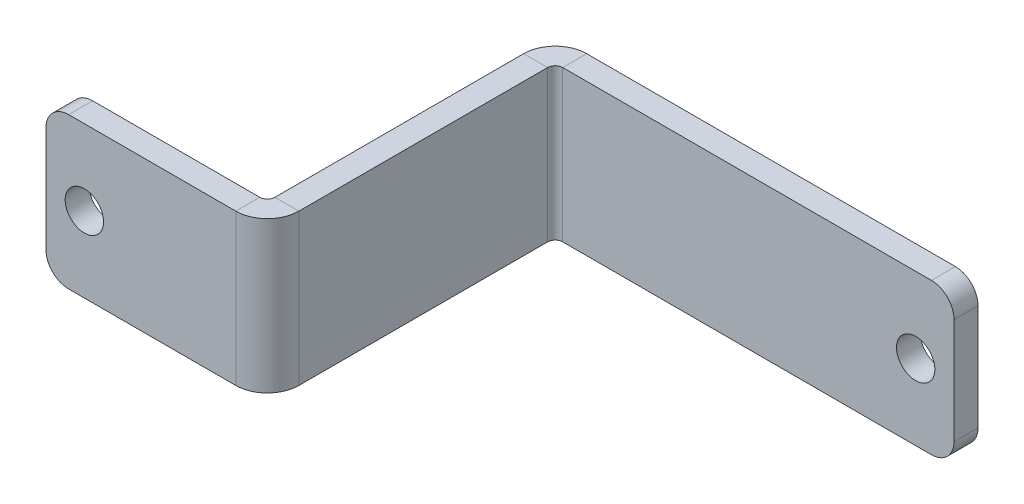
ISO-10303-21;
HEADER;
FILE_DESCRIPTION(('STEP AP214'),'2;1');
FILE_NAME('part.step','',(''),(''),'','','');
FILE_SCHEMA(('AUTOMOTIVE_DESIGN { 1 0 10303 214 1 1 1 1 }'));
ENDSEC;
DATA;
#1=APPLICATION_CONTEXT('core data for automotive mechanical design processes');
#2=APPLICATION_PROTOCOL_DEFINITION('international standard','automotive_design',2000,#1);
#3=PRODUCT_CONTEXT('',#1,'mechanical');
#4=PRODUCT('Part','Part','',(#3));
#5=PRODUCT_RELATED_PRODUCT_CATEGORY('part','',(#4));
#6=PRODUCT_DEFINITION_FORMATION('','',#4);
#7=PRODUCT_DEFINITION_CONTEXT('part definition',#1,'design');
#8=PRODUCT_DEFINITION('design','',#6,#7);
#9=PRODUCT_DEFINITION_SHAPE('','',#8);
#10=(LENGTH_UNIT() NAMED_UNIT(*) SI_UNIT(.MILLI.,.METRE.));
#11=(NAMED_UNIT(*) PLANE_ANGLE_UNIT() SI_UNIT($,.RADIAN.));
#12=(NAMED_UNIT(*) SI_UNIT($,.STERADIAN.) SOLID_ANGLE_UNIT());
#13=UNCERTAINTY_MEASURE_WITH_UNIT(LENGTH_MEASURE(1.E-05),#10,'distance_accuracy_value','');
#14=(GEOMETRIC_REPRESENTATION_CONTEXT(3) GLOBAL_UNCERTAINTY_ASSIGNED_CONTEXT((#13)) GLOBAL_UNIT_ASSIGNED_CONTEXT((#10,
#11,#12)) REPRESENTATION_CONTEXT('',''));
#15=CARTESIAN_POINT('',(0.,0.,0.));
#16=DIRECTION('',(0.,0.,1.));
#17=DIRECTION('',(1.,0.,0.));
#18=AXIS2_PLACEMENT_3D('',#15,#16,#17);
#19=CARTESIAN_POINT('',(104.144613579109,321.12805474167,-1949.68343430085));
#20=DIRECTION('',(0.,1.,0.));
#21=DIRECTION('',(0.,0.,1.));
#22=AXIS2_PLACEMENT_3D('',#19,#20,#21);
#23=PLANE('',#22);
#24=DIRECTION('',(0.,0.,-1.));
#25=VECTOR('',#24,1.);
#26=CARTESIAN_POINT('',(104.144613579109,321.12805474167,-1949.68343430085));
#27=LINE('',#26,#25);
#28=CARTESIAN_POINT('',(104.144613579109,321.12805474167,-1950.68343430085));
#29=VERTEX_POINT('',#28);
#30=CARTESIAN_POINT('',(104.144613579109,321.12805474167,-1983.62883430085));
#31=VERTEX_POINT('',#30);
#32=EDGE_CURVE('E235',#29,#31,#27,.T.);
#33=ORIENTED_EDGE('',*,*,#32,.T.);
#34=DIRECTION('',(-1.,0.,0.));
#35=VECTOR('',#34,1.);
#36=CARTESIAN_POINT('',(104.144613579109,321.12805474167,-1983.62883430085));
#37=LINE('',#36,#35);
#38=CARTESIAN_POINT('',(100.969613579109,321.12805474167,-1983.62883430085));
#39=VERTEX_POINT('',#38);
#40=EDGE_CURVE('E212',#31,#39,#37,.T.);
#41=ORIENTED_EDGE('',*,*,#40,.T.);
#42=DIRECTION('',(0.,0.,-1.));
#43=VECTOR('',#42,1.);
#44=CARTESIAN_POINT('',(100.969613579109,321.12805474167,-1949.68343430085));
#45=LINE('',#44,#43);
#46=CARTESIAN_POINT('',(100.969613579109,321.12805474167,-1950.68343430085));
#47=VERTEX_POINT('',#46);
#48=EDGE_CURVE('E234',#47,#39,#45,.T.);
#49=ORIENTED_EDGE('',*,*,#48,.F.);
#50=DIRECTION('',(1.,0.,0.));
#51=VECTOR('',#50,1.);
#52=CARTESIAN_POINT('',(100.969613579108,321.12805474167,-1950.68343430085));
#53=LINE('',#52,#51);
#54=EDGE_CURVE('E222',#47,#29,#53,.T.);
#55=ORIENTED_EDGE('',*,*,#54,.T.);
#56=EDGE_LOOP('',(#33,#41,#49,#55));
#57=FACE_BOUND('',#56,.T.);
#58=ADVANCED_FACE('F43',(#57),#23,.T.);
#59=CARTESIAN_POINT('',(104.144613579102,0.,3.71965965438128E-13));
#60=DIRECTION('',(-1.,0.,0.));
#61=DIRECTION('',(0.,0.,1.));
#62=AXIS2_PLACEMENT_3D('',#59,#60,#61);
#63=PLANE('',#62);
#64=DIRECTION('',(0.,1.,0.));
#65=VECTOR('',#64,1.);
#66=CARTESIAN_POINT('',(104.144613579109,321.12805474167,-1983.62883430085));
#67=LINE('',#66,#65);
#68=CARTESIAN_POINT('',(104.144613579109,301.12805474167,-1983.62883430085));
#69=VERTEX_POINT('',#68);
#70=EDGE_CURVE('E216',#31,#69,#67,.F.);
#71=ORIENTED_EDGE('',*,*,#70,.F.);
#72=ORIENTED_EDGE('',*,*,#32,.F.);
#73=DIRECTION('',(0.,1.,0.));
#74=VECTOR('',#73,1.);
#75=CARTESIAN_POINT('',(104.144613579109,0.,-1950.68343430085));
#76=LINE('',#75,#74);
#77=CARTESIAN_POINT('',(104.144613579109,301.12805474167,-1950.68343430085));
#78=VERTEX_POINT('',#77);
#79=EDGE_CURVE('E230',#78,#29,#76,.T.);
#80=ORIENTED_EDGE('',*,*,#79,.F.);
#81=DIRECTION('',(0.,0.,1.));
#82=VECTOR('',#81,1.);
#83=CARTESIAN_POINT('',(104.144613579109,301.12805474167,-1984.62883430085));
#84=LINE('',#83,#82);
#85=EDGE_CURVE('E238',#69,#78,#84,.T.);
#86=ORIENTED_EDGE('',*,*,#85,.F.);
#87=EDGE_LOOP('',(#71,#72,#80,#86));
#88=FACE_BOUND('',#87,.T.);
#89=ADVANCED_FACE('F349',(#88),#63,.F.);
#90=CARTESIAN_POINT('',(100.969613579102,0.,3.60880512187302E-13));
#91=DIRECTION('',(-1.,0.,0.));
#92=DIRECTION('',(0.,0.,1.));
#93=AXIS2_PLACEMENT_3D('',#90,#91,#92);
#94=PLANE('',#93);
#95=ORIENTED_EDGE('',*,*,#48,.T.);
#96=DIRECTION('',(0.,1.,0.));
#97=VECTOR('',#96,1.);
#98=CARTESIAN_POINT('',(100.969613579109,321.12805474167,-1983.62883430085));
#99=LINE('',#98,#97);
#100=CARTESIAN_POINT('',(100.969613579109,301.12805474167,-1983.62883430085));
#101=VERTEX_POINT('',#100);
#102=EDGE_CURVE('E180',#39,#101,#99,.F.);
#103=ORIENTED_EDGE('',*,*,#102,.T.);
#104=DIRECTION('',(0.,0.,1.));
#105=VECTOR('',#104,1.);
#106=CARTESIAN_POINT('',(100.969613579109,301.12805474167,-1984.62883430085));
#107=LINE('',#106,#105);
#108=CARTESIAN_POINT('',(100.969613579109,301.12805474167,-1950.68343430085));
#109=VERTEX_POINT('',#108);
#110=EDGE_CURVE('E239',#101,#109,#107,.T.);
#111=ORIENTED_EDGE('',*,*,#110,.T.);
#112=DIRECTION('',(0.,-1.,0.));
#113=VECTOR('',#112,1.);
#114=CARTESIAN_POINT('',(100.969613579108,321.12805474167,-1950.68343430085));
#115=LINE('',#114,#113);
#116=EDGE_CURVE('E224',#47,#109,#115,.T.);
#117=ORIENTED_EDGE('',*,*,#116,.F.);
#118=EDGE_LOOP('',(#95,#103,#111,#117));
#119=FACE_BOUND('',#118,.T.);
#120=ADVANCED_FACE('F356',(#119),#94,.T.);
#121=CARTESIAN_POINT('',(74.8292845848603,321.12805474167,-1946.50843430085));
#122=DIRECTION('',(0.,-1.,0.));
#123=DIRECTION('',(0.,0.,-1.));
#124=AXIS2_PLACEMENT_3D('',#121,#122,#123);
#125=PLANE('',#124);
#126=DIRECTION('',(-1.,0.,0.));
#127=VECTOR('',#126,1.);
#128=CARTESIAN_POINT('',(74.8292845848603,321.12805474167,-1949.68343430085));
#129=LINE('',#128,#127);
#130=CARTESIAN_POINT('',(99.9696135791085,321.12805474167,-1949.68343430085));
#131=VERTEX_POINT('',#130);
#132=CARTESIAN_POINT('',(77.8292845848603,321.12805474167,-1949.68343430085));
#133=VERTEX_POINT('',#132);
#134=EDGE_CURVE('E265',#131,#133,#129,.T.);
#135=ORIENTED_EDGE('',*,*,#134,.T.);
#136=DIRECTION('',(0.,0.,-1.));
#137=VECTOR('',#136,1.);
#138=CARTESIAN_POINT('',(77.8292845848603,321.12805474167,-1946.50843430085));
#139=LINE('',#138,#137);
#140=CARTESIAN_POINT('',(77.8292845848603,321.12805474167,-1946.50843430085));
#141=VERTEX_POINT('',#140);
#142=EDGE_CURVE('E11',#133,#141,#139,.F.);
#143=ORIENTED_EDGE('',*,*,#142,.T.);
#144=DIRECTION('',(-1.,0.,0.));
#145=VECTOR('',#144,1.);
#146=CARTESIAN_POINT('',(74.8292845848603,321.12805474167,-1946.50843430085));
#147=LINE('',#146,#145);
#148=CARTESIAN_POINT('',(99.9696135791085,321.12805474167,-1946.50843430085));
#149=VERTEX_POINT('',#148);
#150=EDGE_CURVE('E268',#149,#141,#147,.T.);
#151=ORIENTED_EDGE('',*,*,#150,.F.);
#152=DIRECTION('',(0.,0.,1.));
#153=VECTOR('',#152,1.);
#154=CARTESIAN_POINT('',(99.9696135791085,321.12805474167,-1949.68343430085));
#155=LINE('',#154,#153);
#156=EDGE_CURVE('E262',#131,#149,#155,.T.);
#157=ORIENTED_EDGE('',*,*,#156,.F.);
#158=EDGE_LOOP('',(#135,#143,#151,#157));
#159=FACE_BOUND('',#158,.T.);
#160=ADVANCED_FACE('F331',(#159),#125,.F.);
#161=CARTESIAN_POINT('',(74.8292845848603,301.12805474167,-1946.50843430085));
#162=DIRECTION('',(0.,1.,0.));
#163=DIRECTION('',(0.,0.,1.));
#164=AXIS2_PLACEMENT_3D('',#161,#162,#163);
#165=PLANE('',#164);
#166=DIRECTION('',(1.,0.,0.));
#167=VECTOR('',#166,1.);
#168=CARTESIAN_POINT('',(74.8292845848603,301.12805474167,-1946.50843430085));
#169=LINE('',#168,#167);
#170=CARTESIAN_POINT('',(77.8292845848603,301.12805474167,-1946.50843430085));
#171=VERTEX_POINT('',#170);
#172=CARTESIAN_POINT('',(99.9696135791085,301.12805474167,-1946.50843430085));
#173=VERTEX_POINT('',#172);
#174=EDGE_CURVE('E273',#171,#173,#169,.T.);
#175=ORIENTED_EDGE('',*,*,#174,.F.);
#176=DIRECTION('',(0.,0.,-1.));
#177=VECTOR('',#176,1.);
#178=CARTESIAN_POINT('',(77.8292845848603,301.12805474167,-1946.50843430085));
#179=LINE('',#178,#177);
#180=CARTESIAN_POINT('',(77.8292845848603,301.12805474167,-1949.68343430085));
#181=VERTEX_POINT('',#180);
#182=EDGE_CURVE('E296',#171,#181,#179,.T.);
#183=ORIENTED_EDGE('',*,*,#182,.T.);
#184=DIRECTION('',(1.,0.,0.));
#185=VECTOR('',#184,1.);
#186=CARTESIAN_POINT('',(74.8292845848603,301.12805474167,-1949.68343430085));
#187=LINE('',#186,#185);
#188=CARTESIAN_POINT('',(99.9696135791085,301.12805474167,-1949.68343430085));
#189=VERTEX_POINT('',#188);
#190=EDGE_CURVE('E271',#181,#189,#187,.T.);
#191=ORIENTED_EDGE('',*,*,#190,.T.);
#192=DIRECTION('',(0.,0.,1.));
#193=VECTOR('',#192,1.);
#194=CARTESIAN_POINT('',(99.9696135791085,301.12805474167,-1949.68343430085));
#195=LINE('',#194,#193);
#196=EDGE_CURVE('E252',#189,#173,#195,.T.);
#197=ORIENTED_EDGE('',*,*,#196,.T.);
#198=EDGE_LOOP('',(#175,#183,#191,#197));
#199=FACE_BOUND('',#198,.T.);
#200=ADVANCED_FACE('F317',(#199),#165,.F.);
#201=CARTESIAN_POINT('',(0.,0.,-1946.50843430085));
#202=DIRECTION('',(0.,0.,1.));
#203=DIRECTION('',(1.,0.,0.));
#204=AXIS2_PLACEMENT_3D('',#201,#202,#203);
#205=PLANE('',#204);
#206=CARTESIAN_POINT('',(79.9092845848603,311.12805474167,-1946.50843430085));
#207=DIRECTION('',(0.,0.,1.));
#208=DIRECTION('',(1.,0.,0.));
#209=AXIS2_PLACEMENT_3D('',#206,#207,#208);
#210=CIRCLE('',#209,2.54);
#211=CARTESIAN_POINT('',(82.4492845848603,311.12805474167,-1946.50843430085));
#212=VERTEX_POINT('',#211);
#213=EDGE_CURVE('E463',#212,#212,#210,.T.);
#214=ORIENTED_EDGE('',*,*,#213,.F.);
#215=EDGE_LOOP('',(#214));
#216=FACE_BOUND('',#215,.T.);
#217=DIRECTION('',(0.,-1.,0.));
#218=VECTOR('',#217,1.);
#219=CARTESIAN_POINT('',(74.8292845848603,321.12805474167,-1946.50843430085));
#220=LINE('',#219,#218);
#221=CARTESIAN_POINT('',(74.8292845848603,318.12805474167,-1946.50843430085));
#222=VERTEX_POINT('',#221);
#223=CARTESIAN_POINT('',(74.8292845848603,304.12805474167,-1946.50843430085));
#224=VERTEX_POINT('',#223);
#225=EDGE_CURVE('E270',#222,#224,#220,.T.);
#226=ORIENTED_EDGE('',*,*,#225,.T.);
#227=CARTESIAN_POINT('',(77.8292845848603,304.12805474167,-1946.50843430085));
#228=DIRECTION('',(0.,0.,1.));
#229=DIRECTION('',(1.,0.,0.));
#230=AXIS2_PLACEMENT_3D('',#227,#228,#229);
#231=CIRCLE('',#230,3.);
#232=EDGE_CURVE('E52',#224,#171,#231,.T.);
#233=ORIENTED_EDGE('',*,*,#232,.T.);
#234=ORIENTED_EDGE('',*,*,#174,.T.);
#235=DIRECTION('',(0.,-1.,0.));
#236=VECTOR('',#235,1.);
#237=CARTESIAN_POINT('',(99.9696135791085,301.12805474167,-1946.50843430085));
#238=LINE('',#237,#236);
#239=EDGE_CURVE('E245',#173,#149,#238,.F.);
#240=ORIENTED_EDGE('',*,*,#239,.T.);
#241=ORIENTED_EDGE('',*,*,#150,.T.);
#242=CARTESIAN_POINT('',(77.8292845848603,318.12805474167,-1946.50843430085));
#243=DIRECTION('',(0.,0.,1.));
#244=DIRECTION('',(1.,0.,0.));
#245=AXIS2_PLACEMENT_3D('',#242,#243,#244);
#246=CIRCLE('',#245,3.);
#247=EDGE_CURVE('E307',#141,#222,#246,.T.);
#248=ORIENTED_EDGE('',*,*,#247,.T.);
#249=EDGE_LOOP('',(#226,#233,#234,#240,#241,#248));
#250=FACE_BOUND('',#249,.T.);
#251=ADVANCED_FACE('F312',(#216,#250),#205,.T.);
#252=CARTESIAN_POINT('',(0.,0.,-1949.68343430085));
#253=DIRECTION('',(0.,0.,1.));
#254=DIRECTION('',(1.,0.,0.));
#255=AXIS2_PLACEMENT_3D('',#252,#253,#254);
#256=PLANE('',#255);
#257=CARTESIAN_POINT('',(79.9092845848603,311.12805474167,-1949.68343430085));
#258=DIRECTION('',(0.,0.,1.));
#259=DIRECTION('',(1.,0.,0.));
#260=AXIS2_PLACEMENT_3D('',#257,#258,#259);
#261=CIRCLE('',#260,2.54);
#262=CARTESIAN_POINT('',(82.4492845848603,311.12805474167,-1949.68343430085));
#263=VERTEX_POINT('',#262);
#264=EDGE_CURVE('E47',#263,#263,#261,.T.);
#265=ORIENTED_EDGE('',*,*,#264,.T.);
#266=EDGE_LOOP('',(#265));
#267=FACE_BOUND('',#266,.T.);
#268=ORIENTED_EDGE('',*,*,#190,.F.);
#269=CARTESIAN_POINT('',(77.8292845848603,304.12805474167,-1949.68343430085));
#270=DIRECTION('',(0.,0.,1.));
#271=DIRECTION('',(1.,0.,0.));
#272=AXIS2_PLACEMENT_3D('',#269,#270,#271);
#273=CIRCLE('',#272,3.);
#274=CARTESIAN_POINT('',(74.8292845848603,304.12805474167,-1949.68343430085));
#275=VERTEX_POINT('',#274);
#276=EDGE_CURVE('E301',#181,#275,#273,.F.);
#277=ORIENTED_EDGE('',*,*,#276,.T.);
#278=DIRECTION('',(0.,-1.,0.));
#279=VECTOR('',#278,1.);
#280=CARTESIAN_POINT('',(74.8292845848603,321.12805474167,-1949.68343430085));
#281=LINE('',#280,#279);
#282=CARTESIAN_POINT('',(74.8292845848603,318.12805474167,-1949.68343430085));
#283=VERTEX_POINT('',#282);
#284=EDGE_CURVE('E277',#283,#275,#281,.T.);
#285=ORIENTED_EDGE('',*,*,#284,.F.);
#286=CARTESIAN_POINT('',(77.8292845848603,318.12805474167,-1949.68343430085));
#287=DIRECTION('',(0.,0.,1.));
#288=DIRECTION('',(1.,0.,0.));
#289=AXIS2_PLACEMENT_3D('',#286,#287,#288);
#290=CIRCLE('',#289,3.);
#291=EDGE_CURVE('E299',#283,#133,#290,.F.);
#292=ORIENTED_EDGE('',*,*,#291,.T.);
#293=ORIENTED_EDGE('',*,*,#134,.F.);
#294=DIRECTION('',(0.,-1.,0.));
#295=VECTOR('',#294,1.);
#296=CARTESIAN_POINT('',(99.9696135791085,301.12805474167,-1949.68343430085));
#297=LINE('',#296,#295);
#298=EDGE_CURVE('E258',#189,#131,#297,.F.);
#299=ORIENTED_EDGE('',*,*,#298,.F.);
#300=EDGE_LOOP('',(#268,#277,#285,#292,#293,#299));
#301=FACE_BOUND('',#300,.T.);
#302=ADVANCED_FACE('F323',(#267,#301),#256,.F.);
#303=CARTESIAN_POINT('',(74.8292845848603,321.12805474167,-1946.50843430085));
#304=DIRECTION('',(1.,0.,0.));
#305=DIRECTION('',(0.,0.,-1.));
#306=AXIS2_PLACEMENT_3D('',#303,#304,#305);
#307=PLANE('',#306);
#308=ORIENTED_EDGE('',*,*,#284,.T.);
#309=DIRECTION('',(0.,0.,-1.));
#310=VECTOR('',#309,1.);
#311=CARTESIAN_POINT('',(74.8292845848603,304.12805474167,-1946.50843430085));
#312=LINE('',#311,#310);
#313=EDGE_CURVE('E65',#275,#224,#312,.F.);
#314=ORIENTED_EDGE('',*,*,#313,.T.);
#315=ORIENTED_EDGE('',*,*,#225,.F.);
#316=DIRECTION('',(0.,0.,-1.));
#317=VECTOR('',#316,1.);
#318=CARTESIAN_POINT('',(74.8292845848603,318.12805474167,-1946.50843430085));
#319=LINE('',#318,#317);
#320=EDGE_CURVE('E303',#222,#283,#319,.T.);
#321=ORIENTED_EDGE('',*,*,#320,.T.);
#322=EDGE_LOOP('',(#308,#314,#315,#321));
#323=FACE_BOUND('',#322,.T.);
#324=ADVANCED_FACE('F325',(#323),#307,.F.);
#325=CARTESIAN_POINT('',(99.9696135791085,321.12805474167,-1950.68343430085));
#326=DIRECTION('',(0.,1.,0.));
#327=DIRECTION('',(0.,0.,1.));
#328=AXIS2_PLACEMENT_3D('',#325,#326,#327);
#329=PLANE('',#328);
#330=ORIENTED_EDGE('',*,*,#54,.F.);
#331=CARTESIAN_POINT('',(99.9696135791085,321.12805474167,-1950.68343430085));
#332=DIRECTION('',(0.,-1.,0.));
#333=DIRECTION('',(0.,0.,-1.));
#334=AXIS2_PLACEMENT_3D('',#331,#332,#333);
#335=CIRCLE('',#334,1.00000000000001);
#336=EDGE_CURVE('E255',#131,#47,#335,.F.);
#337=ORIENTED_EDGE('',*,*,#336,.F.);
#338=ORIENTED_EDGE('',*,*,#156,.T.);
#339=CARTESIAN_POINT('',(99.9696135791085,321.12805474167,-1950.68343430085));
#340=DIRECTION('',(0.,-1.,0.));
#341=DIRECTION('',(0.,0.,-1.));
#342=AXIS2_PLACEMENT_3D('',#339,#340,#341);
#343=CIRCLE('',#342,4.17500000000001);
#344=EDGE_CURVE('E248',#149,#29,#343,.F.);
#345=ORIENTED_EDGE('',*,*,#344,.T.);
#346=EDGE_LOOP('',(#330,#337,#338,#345));
#347=FACE_BOUND('',#346,.T.);
#348=ADVANCED_FACE('F334',(#347),#329,.T.);
#349=CARTESIAN_POINT('',(99.9696135791085,301.12805474167,-1950.68343430085));
#350=DIRECTION('',(0.,1.,0.));
#351=DIRECTION('',(0.,0.,1.));
#352=AXIS2_PLACEMENT_3D('',#349,#350,#351);
#353=PLANE('',#352);
#354=CARTESIAN_POINT('',(99.9696135791085,301.12805474167,-1950.68343430085));
#355=DIRECTION('',(0.,-1.,0.));
#356=DIRECTION('',(0.,0.,-1.));
#357=AXIS2_PLACEMENT_3D('',#354,#355,#356);
#358=CIRCLE('',#357,1.00000000000001);
#359=EDGE_CURVE('E241',#109,#189,#358,.T.);
#360=ORIENTED_EDGE('',*,*,#359,.F.);
#361=DIRECTION('',(1.,0.,0.));
#362=VECTOR('',#361,1.);
#363=CARTESIAN_POINT('',(100.969613579108,301.12805474167,-1950.68343430085));
#364=LINE('',#363,#362);
#365=EDGE_CURVE('E227',#109,#78,#364,.T.);
#366=ORIENTED_EDGE('',*,*,#365,.T.);
#367=CARTESIAN_POINT('',(99.9696135791085,301.12805474167,-1950.68343430085));
#368=DIRECTION('',(0.,-1.,0.));
#369=DIRECTION('',(0.,0.,-1.));
#370=AXIS2_PLACEMENT_3D('',#367,#368,#369);
#371=CIRCLE('',#370,4.17500000000001);
#372=EDGE_CURVE('E249',#78,#173,#371,.T.);
#373=ORIENTED_EDGE('',*,*,#372,.T.);
#374=ORIENTED_EDGE('',*,*,#196,.F.);
#375=EDGE_LOOP('',(#360,#366,#373,#374));
#376=FACE_BOUND('',#375,.T.);
#377=ADVANCED_FACE('F340',(#376),#353,.F.);
#378=CARTESIAN_POINT('',(99.9696135791085,301.12805474167,-1950.68343430085));
#379=DIRECTION('',(0.,-1.,0.));
#380=DIRECTION('',(1.,0.,0.));
#381=AXIS2_PLACEMENT_3D('',#378,#379,#380);
#382=CYLINDRICAL_SURFACE('',#381,4.17500000000001);
#383=ORIENTED_EDGE('',*,*,#239,.F.);
#384=ORIENTED_EDGE('',*,*,#372,.F.);
#385=ORIENTED_EDGE('',*,*,#79,.T.);
#386=ORIENTED_EDGE('',*,*,#344,.F.);
#387=EDGE_LOOP('',(#383,#384,#385,#386));
#388=FACE_BOUND('',#387,.T.);
#389=ADVANCED_FACE('F337',(#388),#382,.T.);
#390=CARTESIAN_POINT('',(99.9696135791085,301.12805474167,-1950.68343430085));
#391=DIRECTION('',(0.,-1.,0.));
#392=DIRECTION('',(1.,0.,0.));
#393=AXIS2_PLACEMENT_3D('',#390,#391,#392);
#394=CYLINDRICAL_SURFACE('',#393,1.00000000000001);
#395=ORIENTED_EDGE('',*,*,#298,.T.);
#396=ORIENTED_EDGE('',*,*,#336,.T.);
#397=ORIENTED_EDGE('',*,*,#116,.T.);
#398=ORIENTED_EDGE('',*,*,#359,.T.);
#399=EDGE_LOOP('',(#395,#396,#397,#398));
#400=FACE_BOUND('',#399,.T.);
#401=ADVANCED_FACE('F354',(#400),#394,.F.);
#402=CARTESIAN_POINT('',(104.144613579109,301.12805474167,-1984.62883430085));
#403=DIRECTION('',(0.,-1.,0.));
#404=DIRECTION('',(0.,0.,-1.));
#405=AXIS2_PLACEMENT_3D('',#402,#403,#404);
#406=PLANE('',#405);
#407=DIRECTION('',(-1.,0.,0.));
#408=VECTOR('',#407,1.);
#409=CARTESIAN_POINT('',(104.144613579109,301.12805474167,-1983.62883430085));
#410=LINE('',#409,#408);
#411=EDGE_CURVE('E219',#69,#101,#410,.T.);
#412=ORIENTED_EDGE('',*,*,#411,.F.);
#413=ORIENTED_EDGE('',*,*,#85,.T.);
#414=ORIENTED_EDGE('',*,*,#365,.F.);
#415=ORIENTED_EDGE('',*,*,#110,.F.);
#416=EDGE_LOOP('',(#412,#413,#414,#415));
#417=FACE_BOUND('',#416,.T.);
#418=ADVANCED_FACE('F358',(#417),#406,.T.);
#419=CARTESIAN_POINT('',(105.144613579109,301.12805474167,-1983.62883430085));
#420=DIRECTION('',(0.,-1.,0.));
#421=DIRECTION('',(0.,0.,-1.));
#422=AXIS2_PLACEMENT_3D('',#419,#420,#421);
#423=PLANE('',#422);
#424=DIRECTION('',(0.,0.,-1.));
#425=VECTOR('',#424,1.);
#426=CARTESIAN_POINT('',(105.144613579109,301.12805474167,-1984.62883430085));
#427=LINE('',#426,#425);
#428=CARTESIAN_POINT('',(105.144613579109,301.12805474167,-1984.62883430085));
#429=VERTEX_POINT('',#428);
#430=CARTESIAN_POINT('',(105.144613579109,301.12805474167,-1987.80383430085));
#431=VERTEX_POINT('',#430);
#432=EDGE_CURVE('E202',#429,#431,#427,.T.);
#433=ORIENTED_EDGE('',*,*,#432,.F.);
#434=CARTESIAN_POINT('',(105.144613579109,301.12805474167,-1983.62883430085));
#435=DIRECTION('',(0.,1.,0.));
#436=DIRECTION('',(0.,0.,1.));
#437=AXIS2_PLACEMENT_3D('',#434,#435,#436);
#438=CIRCLE('',#437,0.99999999999989);
#439=EDGE_CURVE('E183',#69,#429,#438,.F.);
#440=ORIENTED_EDGE('',*,*,#439,.F.);
#441=ORIENTED_EDGE('',*,*,#411,.T.);
#442=CARTESIAN_POINT('',(105.144613579109,301.12805474167,-1983.62883430085));
#443=DIRECTION('',(0.,1.,0.));
#444=DIRECTION('',(0.,0.,1.));
#445=AXIS2_PLACEMENT_3D('',#442,#443,#444);
#446=CIRCLE('',#445,4.17499999999989);
#447=EDGE_CURVE('E211',#101,#431,#446,.F.);
#448=ORIENTED_EDGE('',*,*,#447,.T.);
#449=EDGE_LOOP('',(#433,#440,#441,#448));
#450=FACE_BOUND('',#449,.T.);
#451=ADVANCED_FACE('F361',(#450),#423,.T.);
#452=CARTESIAN_POINT('',(105.144613579109,321.12805474167,-1983.62883430085));
#453=DIRECTION('',(0.,-1.,0.));
#454=DIRECTION('',(0.,0.,-1.));
#455=AXIS2_PLACEMENT_3D('',#452,#453,#454);
#456=PLANE('',#455);
#457=CARTESIAN_POINT('',(105.144613579109,321.12805474167,-1983.62883430085));
#458=DIRECTION('',(0.,1.,0.));
#459=DIRECTION('',(0.,0.,1.));
#460=AXIS2_PLACEMENT_3D('',#457,#458,#459);
#461=CIRCLE('',#460,0.99999999999989);
#462=CARTESIAN_POINT('',(105.144613579109,321.12805474167,-1984.62883430085));
#463=VERTEX_POINT('',#462);
#464=EDGE_CURVE('E170',#463,#31,#461,.T.);
#465=ORIENTED_EDGE('',*,*,#464,.F.);
#466=DIRECTION('',(0.,0.,-1.));
#467=VECTOR('',#466,1.);
#468=CARTESIAN_POINT('',(105.144613579109,321.12805474167,-1984.62883430085));
#469=LINE('',#468,#467);
#470=CARTESIAN_POINT('',(105.144613579109,321.12805474167,-1987.80383430085));
#471=VERTEX_POINT('',#470);
#472=EDGE_CURVE('E164',#463,#471,#469,.T.);
#473=ORIENTED_EDGE('',*,*,#472,.T.);
#474=CARTESIAN_POINT('',(105.144613579109,321.12805474167,-1983.62883430085));
#475=DIRECTION('',(0.,1.,0.));
#476=DIRECTION('',(0.,0.,1.));
#477=AXIS2_PLACEMENT_3D('',#474,#475,#476);
#478=CIRCLE('',#477,4.17499999999989);
#479=EDGE_CURVE('E175',#471,#39,#478,.T.);
#480=ORIENTED_EDGE('',*,*,#479,.T.);
#481=ORIENTED_EDGE('',*,*,#40,.F.);
#482=EDGE_LOOP('',(#465,#473,#480,#481));
#483=FACE_BOUND('',#482,.T.);
#484=ADVANCED_FACE('F186',(#483),#456,.F.);
#485=CARTESIAN_POINT('',(105.144613579109,321.12805474167,-1983.62883430085));
#486=DIRECTION('',(0.,1.,0.));
#487=DIRECTION('',(0.,0.,-1.));
#488=AXIS2_PLACEMENT_3D('',#485,#486,#487);
#489=CYLINDRICAL_SURFACE('',#488,4.17499999999989);
#490=ORIENTED_EDGE('',*,*,#102,.F.);
#491=ORIENTED_EDGE('',*,*,#479,.F.);
#492=DIRECTION('',(0.,-1.,0.));
#493=VECTOR('',#492,1.);
#494=CARTESIAN_POINT('',(105.144613579109,0.,-1987.80383430085));
#495=LINE('',#494,#493);
#496=EDGE_CURVE('E177',#471,#431,#495,.T.);
#497=ORIENTED_EDGE('',*,*,#496,.T.);
#498=ORIENTED_EDGE('',*,*,#447,.F.);
#499=EDGE_LOOP('',(#490,#491,#497,#498));
#500=FACE_BOUND('',#499,.T.);
#501=ADVANCED_FACE('F176',(#500),#489,.T.);
#502=CARTESIAN_POINT('',(105.144613579109,321.12805474167,-1983.62883430085));
#503=DIRECTION('',(0.,1.,0.));
#504=DIRECTION('',(0.,0.,-1.));
#505=AXIS2_PLACEMENT_3D('',#502,#503,#504);
#506=CYLINDRICAL_SURFACE('',#505,0.99999999999989);
#507=ORIENTED_EDGE('',*,*,#70,.T.);
#508=ORIENTED_EDGE('',*,*,#439,.T.);
#509=DIRECTION('',(0.,1.,0.));
#510=VECTOR('',#509,1.);
#511=CARTESIAN_POINT('',(105.144613579109,301.12805474167,-1984.62883430085));
#512=LINE('',#511,#510);
#513=EDGE_CURVE('E188',#429,#463,#512,.T.);
#514=ORIENTED_EDGE('',*,*,#513,.T.);
#515=ORIENTED_EDGE('',*,*,#464,.T.);
#516=EDGE_LOOP('',(#507,#508,#514,#515));
#517=FACE_BOUND('',#516,.T.);
#518=ADVANCED_FACE('F366',(#517),#506,.F.);
#519=CARTESIAN_POINT('',(104.144613579109,301.12805474167,-1987.80383430085));
#520=DIRECTION('',(0.,-1.,0.));
#521=DIRECTION('',(0.,0.,-1.));
#522=AXIS2_PLACEMENT_3D('',#519,#520,#521);
#523=PLANE('',#522);
#524=DIRECTION('',(1.,0.,0.));
#525=VECTOR('',#524,1.);
#526=CARTESIAN_POINT('',(104.144613579109,301.12805474167,-1987.80383430085));
#527=LINE('',#526,#525);
#528=CARTESIAN_POINT('',(153.969613579109,301.12805474167,-1987.80383430085));
#529=VERTEX_POINT('',#528);
#530=EDGE_CURVE('E194',#431,#529,#527,.T.);
#531=ORIENTED_EDGE('',*,*,#530,.T.);
#532=DIRECTION('',(0.,0.,1.));
#533=VECTOR('',#532,1.);
#534=CARTESIAN_POINT('',(153.969613579109,301.12805474167,-1987.80383430085));
#535=LINE('',#534,#533);
#536=CARTESIAN_POINT('',(153.969613579109,301.12805474167,-1984.62883430085));
#537=VERTEX_POINT('',#536);
#538=EDGE_CURVE('E275',#529,#537,#535,.T.);
#539=ORIENTED_EDGE('',*,*,#538,.T.);
#540=DIRECTION('',(1.,0.,0.));
#541=VECTOR('',#540,1.);
#542=CARTESIAN_POINT('',(104.144613579109,301.12805474167,-1984.62883430085));
#543=LINE('',#542,#541);
#544=EDGE_CURVE('E195',#429,#537,#543,.T.);
#545=ORIENTED_EDGE('',*,*,#544,.F.);
#546=ORIENTED_EDGE('',*,*,#432,.T.);
#547=EDGE_LOOP('',(#531,#539,#545,#546));
#548=FACE_BOUND('',#547,.T.);
#549=ADVANCED_FACE('F372',(#548),#523,.T.);
#550=CARTESIAN_POINT('',(156.969613579109,321.12805474167,-1987.80383430085));
#551=DIRECTION('',(0.,1.,0.));
#552=DIRECTION('',(0.,0.,1.));
#553=AXIS2_PLACEMENT_3D('',#550,#551,#552);
#554=PLANE('',#553);
#555=DIRECTION('',(-1.,0.,0.));
#556=VECTOR('',#555,1.);
#557=CARTESIAN_POINT('',(156.969613579109,321.12805474167,-1984.62883430085));
#558=LINE('',#557,#556);
#559=CARTESIAN_POINT('',(153.969613579109,321.12805474167,-1984.62883430085));
#560=VERTEX_POINT('',#559);
#561=EDGE_CURVE('E204',#560,#463,#558,.T.);
#562=ORIENTED_EDGE('',*,*,#561,.F.);
#563=DIRECTION('',(0.,0.,1.));
#564=VECTOR('',#563,1.);
#565=CARTESIAN_POINT('',(153.969613579109,321.12805474167,-1987.80383430085));
#566=LINE('',#565,#564);
#567=CARTESIAN_POINT('',(153.969613579109,321.12805474167,-1987.80383430085));
#568=VERTEX_POINT('',#567);
#569=EDGE_CURVE('E166',#560,#568,#566,.F.);
#570=ORIENTED_EDGE('',*,*,#569,.T.);
#571=DIRECTION('',(-1.,0.,0.));
#572=VECTOR('',#571,1.);
#573=CARTESIAN_POINT('',(156.969613579109,321.12805474167,-1987.80383430085));
#574=LINE('',#573,#572);
#575=EDGE_CURVE('E159',#568,#471,#574,.T.);
#576=ORIENTED_EDGE('',*,*,#575,.T.);
#577=ORIENTED_EDGE('',*,*,#472,.F.);
#578=EDGE_LOOP('',(#562,#570,#576,#577));
#579=FACE_BOUND('',#578,.T.);
#580=ADVANCED_FACE('F162',(#579),#554,.T.);
#581=CARTESIAN_POINT('',(0.,0.,-1987.80383430085));
#582=DIRECTION('',(0.,0.,1.));
#583=DIRECTION('',(1.,0.,0.));
#584=AXIS2_PLACEMENT_3D('',#581,#582,#583);
#585=PLANE('',#584);
#586=CARTESIAN_POINT('',(151.889613579109,311.12805474167,-1987.80383430085));
#587=DIRECTION('',(0.,0.,1.));
#588=DIRECTION('',(1.,0.,0.));
#589=AXIS2_PLACEMENT_3D('',#586,#587,#588);
#590=CIRCLE('',#589,2.53999999999998);
#591=CARTESIAN_POINT('',(154.429613579109,311.12805474167,-1987.80383430085));
#592=VERTEX_POINT('',#591);
#593=EDGE_CURVE('E458',#592,#592,#590,.T.);
#594=ORIENTED_EDGE('',*,*,#593,.T.);
#595=EDGE_LOOP('',(#594));
#596=FACE_BOUND('',#595,.T.);
#597=DIRECTION('',(0.,1.,0.));
#598=VECTOR('',#597,1.);
#599=CARTESIAN_POINT('',(156.969613579109,301.12805474167,-1987.80383430085));
#600=LINE('',#599,#598);
#601=CARTESIAN_POINT('',(156.969613579109,304.12805474167,-1987.80383430085));
#602=VERTEX_POINT('',#601);
#603=CARTESIAN_POINT('',(156.969613579109,318.12805474167,-1987.80383430085));
#604=VERTEX_POINT('',#603);
#605=EDGE_CURVE('E171',#602,#604,#600,.T.);
#606=ORIENTED_EDGE('',*,*,#605,.F.);
#607=CARTESIAN_POINT('',(153.969613579109,304.12805474167,-1987.80383430085));
#608=DIRECTION('',(0.,0.,1.));
#609=DIRECTION('',(1.,0.,0.));
#610=AXIS2_PLACEMENT_3D('',#607,#608,#609);
#611=CIRCLE('',#610,3.);
#612=EDGE_CURVE('E293',#602,#529,#611,.F.);
#613=ORIENTED_EDGE('',*,*,#612,.T.);
#614=ORIENTED_EDGE('',*,*,#530,.F.);
#615=ORIENTED_EDGE('',*,*,#496,.F.);
#616=ORIENTED_EDGE('',*,*,#575,.F.);
#617=CARTESIAN_POINT('',(153.969613579109,318.12805474167,-1987.80383430085));
#618=DIRECTION('',(0.,0.,1.));
#619=DIRECTION('',(1.,0.,0.));
#620=AXIS2_PLACEMENT_3D('',#617,#618,#619);
#621=CIRCLE('',#620,3.);
#622=EDGE_CURVE('E291',#568,#604,#621,.F.);
#623=ORIENTED_EDGE('',*,*,#622,.T.);
#624=EDGE_LOOP('',(#606,#613,#614,#615,#616,#623));
#625=FACE_BOUND('',#624,.T.);
#626=ADVANCED_FACE('F192',(#596,#625),#585,.F.);
#627=CARTESIAN_POINT('',(0.,0.,-1984.62883430085));
#628=DIRECTION('',(0.,0.,1.));
#629=DIRECTION('',(1.,0.,0.));
#630=AXIS2_PLACEMENT_3D('',#627,#628,#629);
#631=PLANE('',#630);
#632=CARTESIAN_POINT('',(151.889613579109,311.12805474167,-1984.62883430085));
#633=DIRECTION('',(0.,0.,1.));
#634=DIRECTION('',(1.,0.,0.));
#635=AXIS2_PLACEMENT_3D('',#632,#633,#634);
#636=CIRCLE('',#635,2.53999999999998);
#637=CARTESIAN_POINT('',(154.429613579109,311.12805474167,-1984.62883430085));
#638=VERTEX_POINT('',#637);
#639=EDGE_CURVE('E461',#638,#638,#636,.T.);
#640=ORIENTED_EDGE('',*,*,#639,.F.);
#641=EDGE_LOOP('',(#640));
#642=FACE_BOUND('',#641,.T.);
#643=ORIENTED_EDGE('',*,*,#544,.T.);
#644=CARTESIAN_POINT('',(153.969613579109,304.12805474167,-1984.62883430085));
#645=DIRECTION('',(0.,0.,1.));
#646=DIRECTION('',(1.,0.,0.));
#647=AXIS2_PLACEMENT_3D('',#644,#645,#646);
#648=CIRCLE('',#647,3.);
#649=CARTESIAN_POINT('',(156.969613579109,304.12805474167,-1984.62883430085));
#650=VERTEX_POINT('',#649);
#651=EDGE_CURVE('E284',#537,#650,#648,.T.);
#652=ORIENTED_EDGE('',*,*,#651,.T.);
#653=DIRECTION('',(0.,1.,0.));
#654=VECTOR('',#653,1.);
#655=CARTESIAN_POINT('',(156.969613579109,301.12805474167,-1984.62883430085));
#656=LINE('',#655,#654);
#657=CARTESIAN_POINT('',(156.969613579109,318.12805474167,-1984.62883430085));
#658=VERTEX_POINT('',#657);
#659=EDGE_CURVE('E198',#650,#658,#656,.T.);
#660=ORIENTED_EDGE('',*,*,#659,.T.);
#661=CARTESIAN_POINT('',(153.969613579109,318.12805474167,-1984.62883430085));
#662=DIRECTION('',(0.,0.,1.));
#663=DIRECTION('',(1.,0.,0.));
#664=AXIS2_PLACEMENT_3D('',#661,#662,#663);
#665=CIRCLE('',#664,3.);
#666=EDGE_CURVE('E282',#658,#560,#665,.T.);
#667=ORIENTED_EDGE('',*,*,#666,.T.);
#668=ORIENTED_EDGE('',*,*,#561,.T.);
#669=ORIENTED_EDGE('',*,*,#513,.F.);
#670=EDGE_LOOP('',(#643,#652,#660,#667,#668,#669));
#671=FACE_BOUND('',#670,.T.);
#672=ADVANCED_FACE('F369',(#642,#671),#631,.T.);
#673=CARTESIAN_POINT('',(156.969613579109,301.12805474167,-1987.80383430085));
#674=DIRECTION('',(1.,0.,0.));
#675=DIRECTION('',(0.,0.,-1.));
#676=AXIS2_PLACEMENT_3D('',#673,#674,#675);
#677=PLANE('',#676);
#678=ORIENTED_EDGE('',*,*,#659,.F.);
#679=DIRECTION('',(0.,0.,1.));
#680=VECTOR('',#679,1.);
#681=CARTESIAN_POINT('',(156.969613579109,304.12805474167,-1987.80383430085));
#682=LINE('',#681,#680);
#683=EDGE_CURVE('E289',#650,#602,#682,.F.);
#684=ORIENTED_EDGE('',*,*,#683,.T.);
#685=ORIENTED_EDGE('',*,*,#605,.T.);
#686=DIRECTION('',(0.,0.,1.));
#687=VECTOR('',#686,1.);
#688=CARTESIAN_POINT('',(156.969613579109,318.12805474167,-1987.80383430085));
#689=LINE('',#688,#687);
#690=EDGE_CURVE('E286',#604,#658,#689,.T.);
#691=ORIENTED_EDGE('',*,*,#690,.T.);
#692=EDGE_LOOP('',(#678,#684,#685,#691));
#693=FACE_BOUND('',#692,.T.);
#694=ADVANCED_FACE('F380',(#693),#677,.T.);
#695=CARTESIAN_POINT('',(153.969613579109,304.12805474167,-1987.80383430085));
#696=DIRECTION('',(0.,0.,1.));
#697=DIRECTION('',(1.,0.,0.));
#698=AXIS2_PLACEMENT_3D('',#695,#696,#697);
#699=CYLINDRICAL_SURFACE('',#698,3.);
#700=ORIENTED_EDGE('',*,*,#612,.F.);
#701=ORIENTED_EDGE('',*,*,#683,.F.);
#702=ORIENTED_EDGE('',*,*,#651,.F.);
#703=ORIENTED_EDGE('',*,*,#538,.F.);
#704=EDGE_LOOP('',(#700,#701,#702,#703));
#705=FACE_BOUND('',#704,.T.);
#706=ADVANCED_FACE('F376',(#705),#699,.T.);
#707=CARTESIAN_POINT('',(153.969613579109,318.12805474167,-1987.80383430085));
#708=DIRECTION('',(0.,0.,1.));
#709=DIRECTION('',(1.,0.,0.));
#710=AXIS2_PLACEMENT_3D('',#707,#708,#709);
#711=CYLINDRICAL_SURFACE('',#710,3.);
#712=ORIENTED_EDGE('',*,*,#622,.F.);
#713=ORIENTED_EDGE('',*,*,#569,.F.);
#714=ORIENTED_EDGE('',*,*,#666,.F.);
#715=ORIENTED_EDGE('',*,*,#690,.F.);
#716=EDGE_LOOP('',(#712,#713,#714,#715));
#717=FACE_BOUND('',#716,.T.);
#718=ADVANCED_FACE('F383',(#717),#711,.T.);
#719=CARTESIAN_POINT('',(77.8292845848603,304.12805474167,-1946.50843430085));
#720=DIRECTION('',(0.,0.,-1.));
#721=DIRECTION('',(-1.,0.,0.));
#722=AXIS2_PLACEMENT_3D('',#719,#720,#721);
#723=CYLINDRICAL_SURFACE('',#722,3.);
#724=ORIENTED_EDGE('',*,*,#232,.F.);
#725=ORIENTED_EDGE('',*,*,#313,.F.);
#726=ORIENTED_EDGE('',*,*,#276,.F.);
#727=ORIENTED_EDGE('',*,*,#182,.F.);
#728=EDGE_LOOP('',(#724,#725,#726,#727));
#729=FACE_BOUND('',#728,.T.);
#730=ADVANCED_FACE('F320',(#729),#723,.T.);
#731=CARTESIAN_POINT('',(77.8292845848603,318.12805474167,-1946.50843430085));
#732=DIRECTION('',(0.,0.,-1.));
#733=DIRECTION('',(-1.,0.,0.));
#734=AXIS2_PLACEMENT_3D('',#731,#732,#733);
#735=CYLINDRICAL_SURFACE('',#734,3.);
#736=ORIENTED_EDGE('',*,*,#247,.F.);
#737=ORIENTED_EDGE('',*,*,#142,.F.);
#738=ORIENTED_EDGE('',*,*,#291,.F.);
#739=ORIENTED_EDGE('',*,*,#320,.F.);
#740=EDGE_LOOP('',(#736,#737,#738,#739));
#741=FACE_BOUND('',#740,.T.);
#742=ADVANCED_FACE('F45',(#741),#735,.T.);
#743=CARTESIAN_POINT('',(79.9092845848603,311.12805474167,-1987.80383430085));
#744=DIRECTION('',(0.,0.,1.));
#745=DIRECTION('',(1.,0.,0.));
#746=AXIS2_PLACEMENT_3D('',#743,#744,#745);
#747=CYLINDRICAL_SURFACE('',#746,2.54);
#748=ORIENTED_EDGE('',*,*,#213,.T.);
#749=EDGE_LOOP('',(#748));
#750=FACE_BOUND('',#749,.T.);
#751=ORIENTED_EDGE('',*,*,#264,.F.);
#752=EDGE_LOOP('',(#751));
#753=FACE_BOUND('',#752,.T.);
#754=ADVANCED_FACE('F446',(#750,#753),#747,.F.);
#755=CARTESIAN_POINT('',(151.889613579109,311.12805474167,-1987.80383430085));
#756=DIRECTION('',(0.,0.,1.));
#757=DIRECTION('',(1.,0.,0.));
#758=AXIS2_PLACEMENT_3D('',#755,#756,#757);
#759=CYLINDRICAL_SURFACE('',#758,2.53999999999998);
#760=ORIENTED_EDGE('',*,*,#593,.F.);
#761=EDGE_LOOP('',(#760));
#762=FACE_BOUND('',#761,.T.);
#763=ORIENTED_EDGE('',*,*,#639,.T.);
#764=EDGE_LOOP('',(#763));
#765=FACE_BOUND('',#764,.T.);
#766=ADVANCED_FACE('F449',(#762,#765),#759,.F.);
#767=CLOSED_SHELL('',(#58,#89,#120,#160,#200,#251,#302,#324,#348,#377,#389,#401,#418,#451,#484,
#501,#518,#549,#580,#626,#672,#694,#706,#718,#730,#742,#754,#766));
#768=MANIFOLD_SOLID_BREP('B2',#767);
#769=ADVANCED_BREP_SHAPE_REPRESENTATION('',(#18,#768),#14);
#770=SHAPE_DEFINITION_REPRESENTATION(#9,#769);
ENDSEC;
END-ISO-10303-21;
